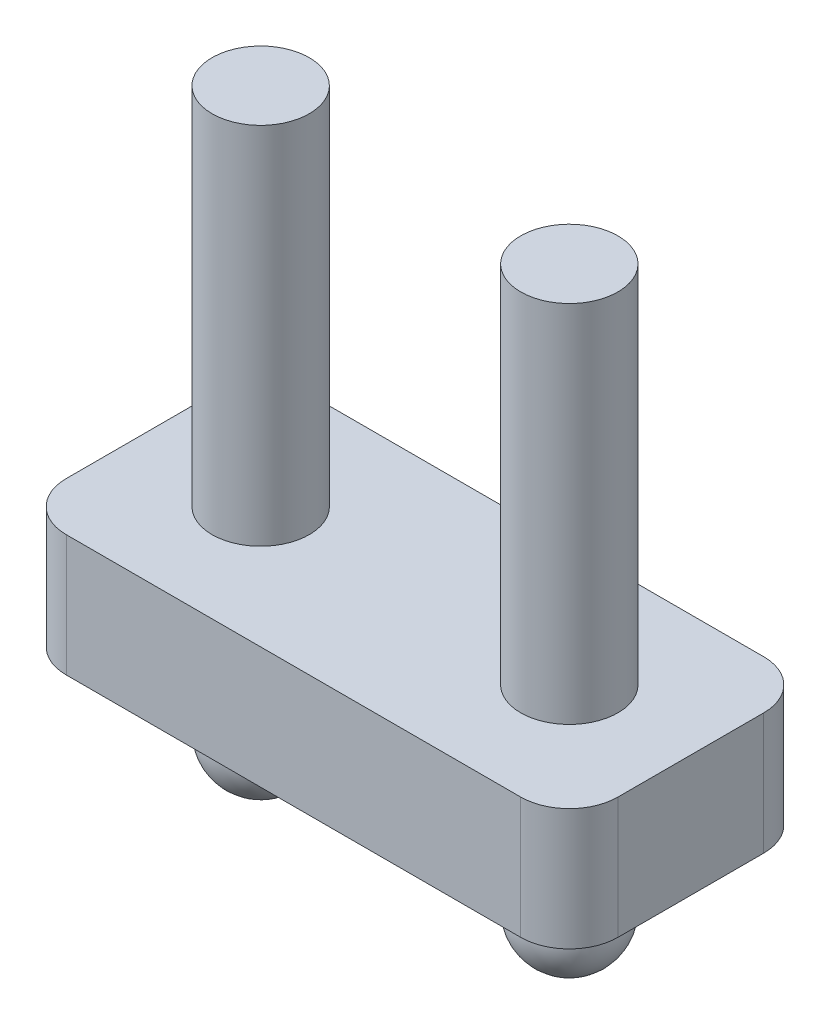
ISO-10303-21;
HEADER;
FILE_DESCRIPTION(('STEP AP214'),'2;1');
FILE_NAME('part.step','',(''),(''),'','','');
FILE_SCHEMA(('AUTOMOTIVE_DESIGN { 1 0 10303 214 1 1 1 1 }'));
ENDSEC;
DATA;
#1=APPLICATION_CONTEXT('core data for automotive mechanical design processes');
#2=APPLICATION_PROTOCOL_DEFINITION('international standard','automotive_design',2000,#1);
#3=PRODUCT_CONTEXT('',#1,'mechanical');
#4=PRODUCT('Part','Part','',(#3));
#5=PRODUCT_RELATED_PRODUCT_CATEGORY('part','',(#4));
#6=PRODUCT_DEFINITION_FORMATION('','',#4);
#7=PRODUCT_DEFINITION_CONTEXT('part definition',#1,'design');
#8=PRODUCT_DEFINITION('design','',#6,#7);
#9=PRODUCT_DEFINITION_SHAPE('','',#8);
#10=(LENGTH_UNIT() NAMED_UNIT(*) SI_UNIT(.MILLI.,.METRE.));
#11=(NAMED_UNIT(*) PLANE_ANGLE_UNIT() SI_UNIT($,.RADIAN.));
#12=(NAMED_UNIT(*) SI_UNIT($,.STERADIAN.) SOLID_ANGLE_UNIT());
#13=UNCERTAINTY_MEASURE_WITH_UNIT(LENGTH_MEASURE(1.E-05),#10,'distance_accuracy_value','');
#14=(GEOMETRIC_REPRESENTATION_CONTEXT(3) GLOBAL_UNCERTAINTY_ASSIGNED_CONTEXT((#13)) GLOBAL_UNIT_ASSIGNED_CONTEXT((#10,
#11,#12)) REPRESENTATION_CONTEXT('',''));
#15=CARTESIAN_POINT('',(0.,0.,0.));
#16=DIRECTION('',(0.,0.,1.));
#17=DIRECTION('',(1.,0.,0.));
#18=AXIS2_PLACEMENT_3D('',#15,#16,#17);
#19=CARTESIAN_POINT('',(0.,1.,0.));
#20=DIRECTION('',(0.,-1.,0.));
#21=DIRECTION('',(0.,0.,-1.));
#22=AXIS2_PLACEMENT_3D('',#19,#20,#21);
#23=PLANE('',#22);
#24=DIRECTION('',(-1.,0.,0.));
#25=VECTOR('',#24,1.);
#26=CARTESIAN_POINT('',(0.,1.,-2.));
#27=LINE('',#26,#25);
#28=CARTESIAN_POINT('',(4.14,1.,-2.));
#29=VERTEX_POINT('',#28);
#30=CARTESIAN_POINT('',(0.4,1.,-2.));
#31=VERTEX_POINT('',#30);
#32=EDGE_CURVE('E145',#29,#31,#27,.T.);
#33=ORIENTED_EDGE('',*,*,#32,.T.);
#34=CARTESIAN_POINT('',(0.4,1.,-1.6));
#35=DIRECTION('',(0.,-1.,0.));
#36=DIRECTION('',(0.,0.,-1.));
#37=AXIS2_PLACEMENT_3D('',#34,#35,#36);
#38=CIRCLE('',#37,0.4);
#39=CARTESIAN_POINT('',(0.,1.,-1.6));
#40=VERTEX_POINT('',#39);
#41=EDGE_CURVE('E164',#31,#40,#38,.F.);
#42=ORIENTED_EDGE('',*,*,#41,.T.);
#43=DIRECTION('',(0.,0.,1.));
#44=VECTOR('',#43,1.);
#45=CARTESIAN_POINT('',(0.,1.,0.));
#46=LINE('',#45,#44);
#47=CARTESIAN_POINT('',(0.,1.,-0.4));
#48=VERTEX_POINT('',#47);
#49=EDGE_CURVE('E128',#40,#48,#46,.T.);
#50=ORIENTED_EDGE('',*,*,#49,.T.);
#51=CARTESIAN_POINT('',(0.4,1.,-0.4));
#52=DIRECTION('',(0.,-1.,0.));
#53=DIRECTION('',(0.,0.,-1.));
#54=AXIS2_PLACEMENT_3D('',#51,#52,#53);
#55=CIRCLE('',#54,0.4);
#56=CARTESIAN_POINT('',(0.4,1.,0.));
#57=VERTEX_POINT('',#56);
#58=EDGE_CURVE('E159',#48,#57,#55,.F.);
#59=ORIENTED_EDGE('',*,*,#58,.T.);
#60=DIRECTION('',(1.,0.,0.));
#61=VECTOR('',#60,1.);
#62=CARTESIAN_POINT('',(0.,1.,0.));
#63=LINE('',#62,#61);
#64=CARTESIAN_POINT('',(4.14,1.,0.));
#65=VERTEX_POINT('',#64);
#66=EDGE_CURVE('E236',#57,#65,#63,.T.);
#67=ORIENTED_EDGE('',*,*,#66,.T.);
#68=CARTESIAN_POINT('',(4.14,1.,-0.4));
#69=DIRECTION('',(0.,-1.,0.));
#70=DIRECTION('',(0.,0.,-1.));
#71=AXIS2_PLACEMENT_3D('',#68,#69,#70);
#72=CIRCLE('',#71,0.4);
#73=CARTESIAN_POINT('',(4.54,1.,-0.4));
#74=VERTEX_POINT('',#73);
#75=EDGE_CURVE('E63',#65,#74,#72,.F.);
#76=ORIENTED_EDGE('',*,*,#75,.T.);
#77=DIRECTION('',(0.,0.,-1.));
#78=VECTOR('',#77,1.);
#79=CARTESIAN_POINT('',(4.54,1.,0.));
#80=LINE('',#79,#78);
#81=CARTESIAN_POINT('',(4.54,1.,-1.6));
#82=VERTEX_POINT('',#81);
#83=EDGE_CURVE('E238',#74,#82,#80,.T.);
#84=ORIENTED_EDGE('',*,*,#83,.T.);
#85=CARTESIAN_POINT('',(4.14,1.,-1.6));
#86=DIRECTION('',(0.,-1.,0.));
#87=DIRECTION('',(0.,0.,-1.));
#88=AXIS2_PLACEMENT_3D('',#85,#86,#87);
#89=CIRCLE('',#88,0.4);
#90=EDGE_CURVE('E162',#82,#29,#89,.F.);
#91=ORIENTED_EDGE('',*,*,#90,.T.);
#92=EDGE_LOOP('',(#33,#42,#50,#59,#67,#76,#84,#91));
#93=FACE_BOUND('',#92,.T.);
#94=CARTESIAN_POINT('',(1.,1.,-1.));
#95=DIRECTION('',(0.,1.,0.));
#96=DIRECTION('',(0.,0.,1.));
#97=AXIS2_PLACEMENT_3D('',#94,#95,#96);
#98=CIRCLE('',#97,0.4);
#99=CARTESIAN_POINT('',(1.,1.,-0.6));
#100=VERTEX_POINT('',#99);
#101=EDGE_CURVE('E136',#100,#100,#98,.T.);
#102=ORIENTED_EDGE('',*,*,#101,.F.);
#103=EDGE_LOOP('',(#102));
#104=FACE_BOUND('',#103,.T.);
#105=CARTESIAN_POINT('',(3.54,1.,-1.));
#106=DIRECTION('',(0.,1.,0.));
#107=DIRECTION('',(0.,0.,1.));
#108=AXIS2_PLACEMENT_3D('',#105,#106,#107);
#109=CIRCLE('',#108,0.400000000000002);
#110=CARTESIAN_POINT('',(3.54,1.,-0.599999999999998));
#111=VERTEX_POINT('',#110);
#112=EDGE_CURVE('E142',#111,#111,#109,.T.);
#113=ORIENTED_EDGE('',*,*,#112,.F.);
#114=EDGE_LOOP('',(#113));
#115=FACE_BOUND('',#114,.T.);
#116=ADVANCED_FACE('F41',(#93,#104,#115),#23,.F.);
#117=CARTESIAN_POINT('',(0.,0.,0.));
#118=DIRECTION('',(0.,-1.,0.));
#119=DIRECTION('',(0.,0.,-1.));
#120=AXIS2_PLACEMENT_3D('',#117,#118,#119);
#121=PLANE('',#120);
#122=CARTESIAN_POINT('',(1.,0.,-1.));
#123=DIRECTION('',(0.,-1.,0.));
#124=DIRECTION('',(0.,0.,-1.));
#125=AXIS2_PLACEMENT_3D('',#122,#123,#124);
#126=CIRCLE('',#125,0.4);
#127=CARTESIAN_POINT('',(1.,0.,-1.4));
#128=VERTEX_POINT('',#127);
#129=EDGE_CURVE('E244',#128,#128,#126,.T.);
#130=ORIENTED_EDGE('',*,*,#129,.F.);
#131=EDGE_LOOP('',(#130));
#132=FACE_BOUND('',#131,.T.);
#133=DIRECTION('',(0.,0.,1.));
#134=VECTOR('',#133,1.);
#135=CARTESIAN_POINT('',(0.,0.,0.));
#136=LINE('',#135,#134);
#137=CARTESIAN_POINT('',(0.,0.,-1.6));
#138=VERTEX_POINT('',#137);
#139=CARTESIAN_POINT('',(0.,0.,-0.4));
#140=VERTEX_POINT('',#139);
#141=EDGE_CURVE('E125',#138,#140,#136,.T.);
#142=ORIENTED_EDGE('',*,*,#141,.F.);
#143=CARTESIAN_POINT('',(0.4,0.,-1.6));
#144=DIRECTION('',(0.,-1.,0.));
#145=DIRECTION('',(0.,0.,-1.));
#146=AXIS2_PLACEMENT_3D('',#143,#144,#145);
#147=CIRCLE('',#146,0.4);
#148=CARTESIAN_POINT('',(0.4,0.,-2.));
#149=VERTEX_POINT('',#148);
#150=EDGE_CURVE('E108',#138,#149,#147,.T.);
#151=ORIENTED_EDGE('',*,*,#150,.T.);
#152=DIRECTION('',(-1.,0.,0.));
#153=VECTOR('',#152,1.);
#154=CARTESIAN_POINT('',(0.,0.,-2.));
#155=LINE('',#154,#153);
#156=CARTESIAN_POINT('',(4.14,0.,-2.));
#157=VERTEX_POINT('',#156);
#158=EDGE_CURVE('E149',#157,#149,#155,.T.);
#159=ORIENTED_EDGE('',*,*,#158,.F.);
#160=CARTESIAN_POINT('',(4.14,0.,-1.6));
#161=DIRECTION('',(0.,-1.,0.));
#162=DIRECTION('',(0.,0.,-1.));
#163=AXIS2_PLACEMENT_3D('',#160,#161,#162);
#164=CIRCLE('',#163,0.4);
#165=CARTESIAN_POINT('',(4.54,0.,-1.6));
#166=VERTEX_POINT('',#165);
#167=EDGE_CURVE('E119',#157,#166,#164,.T.);
#168=ORIENTED_EDGE('',*,*,#167,.T.);
#169=DIRECTION('',(0.,0.,-1.));
#170=VECTOR('',#169,1.);
#171=CARTESIAN_POINT('',(4.54,0.,0.));
#172=LINE('',#171,#170);
#173=CARTESIAN_POINT('',(4.54,0.,-0.4));
#174=VERTEX_POINT('',#173);
#175=EDGE_CURVE('E139',#174,#166,#172,.T.);
#176=ORIENTED_EDGE('',*,*,#175,.F.);
#177=CARTESIAN_POINT('',(4.14,0.,-0.4));
#178=DIRECTION('',(0.,-1.,0.));
#179=DIRECTION('',(0.,0.,-1.));
#180=AXIS2_PLACEMENT_3D('',#177,#178,#179);
#181=CIRCLE('',#180,0.4);
#182=CARTESIAN_POINT('',(4.14,0.,0.));
#183=VERTEX_POINT('',#182);
#184=EDGE_CURVE('E153',#174,#183,#181,.T.);
#185=ORIENTED_EDGE('',*,*,#184,.T.);
#186=DIRECTION('',(1.,0.,0.));
#187=VECTOR('',#186,1.);
#188=CARTESIAN_POINT('',(0.,0.,0.));
#189=LINE('',#188,#187);
#190=CARTESIAN_POINT('',(0.4,0.,0.));
#191=VERTEX_POINT('',#190);
#192=EDGE_CURVE('E135',#191,#183,#189,.T.);
#193=ORIENTED_EDGE('',*,*,#192,.F.);
#194=CARTESIAN_POINT('',(0.4,0.,-0.4));
#195=DIRECTION('',(0.,-1.,0.));
#196=DIRECTION('',(0.,0.,-1.));
#197=AXIS2_PLACEMENT_3D('',#194,#195,#196);
#198=CIRCLE('',#197,0.4);
#199=EDGE_CURVE('E129',#191,#140,#198,.T.);
#200=ORIENTED_EDGE('',*,*,#199,.T.);
#201=EDGE_LOOP('',(#142,#151,#159,#168,#176,#185,#193,#200));
#202=FACE_BOUND('',#201,.T.);
#203=CARTESIAN_POINT('',(3.54,0.,-1.));
#204=DIRECTION('',(0.,-1.,0.));
#205=DIRECTION('',(0.,0.,-1.));
#206=AXIS2_PLACEMENT_3D('',#203,#204,#205);
#207=CIRCLE('',#206,0.400000000000002);
#208=CARTESIAN_POINT('',(3.54,0.,-1.4));
#209=VERTEX_POINT('',#208);
#210=EDGE_CURVE('E250',#209,#209,#207,.T.);
#211=ORIENTED_EDGE('',*,*,#210,.F.);
#212=EDGE_LOOP('',(#211));
#213=FACE_BOUND('',#212,.T.);
#214=ADVANCED_FACE('F132',(#132,#202,#213),#121,.T.);
#215=CARTESIAN_POINT('',(0.,1.,0.));
#216=DIRECTION('',(1.,0.,0.));
#217=DIRECTION('',(0.,0.,-1.));
#218=AXIS2_PLACEMENT_3D('',#215,#216,#217);
#219=PLANE('',#218);
#220=ORIENTED_EDGE('',*,*,#49,.F.);
#221=DIRECTION('',(0.,-1.,0.));
#222=VECTOR('',#221,1.);
#223=CARTESIAN_POINT('',(0.,1.,-1.6));
#224=LINE('',#223,#222);
#225=EDGE_CURVE('E112',#40,#138,#224,.T.);
#226=ORIENTED_EDGE('',*,*,#225,.T.);
#227=ORIENTED_EDGE('',*,*,#141,.T.);
#228=DIRECTION('',(0.,-1.,0.));
#229=VECTOR('',#228,1.);
#230=CARTESIAN_POINT('',(0.,1.,-0.4));
#231=LINE('',#230,#229);
#232=EDGE_CURVE('E130',#140,#48,#231,.F.);
#233=ORIENTED_EDGE('',*,*,#232,.T.);
#234=EDGE_LOOP('',(#220,#226,#227,#233));
#235=FACE_BOUND('',#234,.T.);
#236=ADVANCED_FACE('F124',(#235),#219,.F.);
#237=CARTESIAN_POINT('',(0.,1.,0.));
#238=DIRECTION('',(0.,0.,-1.));
#239=DIRECTION('',(-1.,0.,0.));
#240=AXIS2_PLACEMENT_3D('',#237,#238,#239);
#241=PLANE('',#240);
#242=ORIENTED_EDGE('',*,*,#192,.T.);
#243=DIRECTION('',(0.,-1.,0.));
#244=VECTOR('',#243,1.);
#245=CARTESIAN_POINT('',(4.14,1.,0.));
#246=LINE('',#245,#244);
#247=EDGE_CURVE('E173',#183,#65,#246,.F.);
#248=ORIENTED_EDGE('',*,*,#247,.T.);
#249=ORIENTED_EDGE('',*,*,#66,.F.);
#250=DIRECTION('',(0.,-1.,0.));
#251=VECTOR('',#250,1.);
#252=CARTESIAN_POINT('',(0.4,1.,0.));
#253=LINE('',#252,#251);
#254=EDGE_CURVE('E170',#57,#191,#253,.T.);
#255=ORIENTED_EDGE('',*,*,#254,.T.);
#256=EDGE_LOOP('',(#242,#248,#249,#255));
#257=FACE_BOUND('',#256,.T.);
#258=ADVANCED_FACE('F211',(#257),#241,.F.);
#259=CARTESIAN_POINT('',(4.54,1.,0.));
#260=DIRECTION('',(-1.,0.,0.));
#261=DIRECTION('',(0.,0.,1.));
#262=AXIS2_PLACEMENT_3D('',#259,#260,#261);
#263=PLANE('',#262);
#264=ORIENTED_EDGE('',*,*,#175,.T.);
#265=DIRECTION('',(0.,-1.,0.));
#266=VECTOR('',#265,1.);
#267=CARTESIAN_POINT('',(4.54,1.,-1.6));
#268=LINE('',#267,#266);
#269=EDGE_CURVE('E56',#166,#82,#268,.F.);
#270=ORIENTED_EDGE('',*,*,#269,.T.);
#271=ORIENTED_EDGE('',*,*,#83,.F.);
#272=DIRECTION('',(0.,-1.,0.));
#273=VECTOR('',#272,1.);
#274=CARTESIAN_POINT('',(4.54,1.,-0.4));
#275=LINE('',#274,#273);
#276=EDGE_CURVE('E166',#74,#174,#275,.T.);
#277=ORIENTED_EDGE('',*,*,#276,.T.);
#278=EDGE_LOOP('',(#264,#270,#271,#277));
#279=FACE_BOUND('',#278,.T.);
#280=ADVANCED_FACE('F207',(#279),#263,.F.);
#281=CARTESIAN_POINT('',(0.,1.,-2.));
#282=DIRECTION('',(0.,0.,1.));
#283=DIRECTION('',(1.,0.,0.));
#284=AXIS2_PLACEMENT_3D('',#281,#282,#283);
#285=PLANE('',#284);
#286=ORIENTED_EDGE('',*,*,#158,.T.);
#287=DIRECTION('',(0.,-1.,0.));
#288=VECTOR('',#287,1.);
#289=CARTESIAN_POINT('',(0.4,1.,-2.));
#290=LINE('',#289,#288);
#291=EDGE_CURVE('E113',#149,#31,#290,.F.);
#292=ORIENTED_EDGE('',*,*,#291,.T.);
#293=ORIENTED_EDGE('',*,*,#32,.F.);
#294=DIRECTION('',(0.,-1.,0.));
#295=VECTOR('',#294,1.);
#296=CARTESIAN_POINT('',(4.14,1.,-2.));
#297=LINE('',#296,#295);
#298=EDGE_CURVE('E118',#29,#157,#297,.T.);
#299=ORIENTED_EDGE('',*,*,#298,.T.);
#300=EDGE_LOOP('',(#286,#292,#293,#299));
#301=FACE_BOUND('',#300,.T.);
#302=ADVANCED_FACE('F204',(#301),#285,.F.);
#303=CARTESIAN_POINT('',(0.4,1.,-1.6));
#304=DIRECTION('',(0.,-1.,0.));
#305=DIRECTION('',(0.,0.,-1.));
#306=AXIS2_PLACEMENT_3D('',#303,#304,#305);
#307=CYLINDRICAL_SURFACE('',#306,0.4);
#308=ORIENTED_EDGE('',*,*,#41,.F.);
#309=ORIENTED_EDGE('',*,*,#291,.F.);
#310=ORIENTED_EDGE('',*,*,#150,.F.);
#311=ORIENTED_EDGE('',*,*,#225,.F.);
#312=EDGE_LOOP('',(#308,#309,#310,#311));
#313=FACE_BOUND('',#312,.T.);
#314=ADVANCED_FACE('F111',(#313),#307,.T.);
#315=CARTESIAN_POINT('',(4.14,1.,-1.6));
#316=DIRECTION('',(0.,-1.,0.));
#317=DIRECTION('',(0.,0.,-1.));
#318=AXIS2_PLACEMENT_3D('',#315,#316,#317);
#319=CYLINDRICAL_SURFACE('',#318,0.4);
#320=ORIENTED_EDGE('',*,*,#90,.F.);
#321=ORIENTED_EDGE('',*,*,#269,.F.);
#322=ORIENTED_EDGE('',*,*,#167,.F.);
#323=ORIENTED_EDGE('',*,*,#298,.F.);
#324=EDGE_LOOP('',(#320,#321,#322,#323));
#325=FACE_BOUND('',#324,.T.);
#326=ADVANCED_FACE('F219',(#325),#319,.T.);
#327=CARTESIAN_POINT('',(4.14,1.,-0.4));
#328=DIRECTION('',(0.,-1.,0.));
#329=DIRECTION('',(0.,0.,-1.));
#330=AXIS2_PLACEMENT_3D('',#327,#328,#329);
#331=CYLINDRICAL_SURFACE('',#330,0.4);
#332=ORIENTED_EDGE('',*,*,#75,.F.);
#333=ORIENTED_EDGE('',*,*,#247,.F.);
#334=ORIENTED_EDGE('',*,*,#184,.F.);
#335=ORIENTED_EDGE('',*,*,#276,.F.);
#336=EDGE_LOOP('',(#332,#333,#334,#335));
#337=FACE_BOUND('',#336,.T.);
#338=ADVANCED_FACE('F222',(#337),#331,.T.);
#339=CARTESIAN_POINT('',(0.4,1.,-0.4));
#340=DIRECTION('',(0.,-1.,0.));
#341=DIRECTION('',(0.,0.,-1.));
#342=AXIS2_PLACEMENT_3D('',#339,#340,#341);
#343=CYLINDRICAL_SURFACE('',#342,0.4);
#344=ORIENTED_EDGE('',*,*,#58,.F.);
#345=ORIENTED_EDGE('',*,*,#232,.F.);
#346=ORIENTED_EDGE('',*,*,#199,.F.);
#347=ORIENTED_EDGE('',*,*,#254,.F.);
#348=EDGE_LOOP('',(#344,#345,#346,#347));
#349=FACE_BOUND('',#348,.T.);
#350=ADVANCED_FACE('F225',(#349),#343,.T.);
#351=CARTESIAN_POINT('',(1.,-1.,-1.));
#352=DIRECTION('',(0.,1.,0.));
#353=DIRECTION('',(0.,0.,1.));
#354=AXIS2_PLACEMENT_3D('',#351,#352,#353);
#355=CYLINDRICAL_SURFACE('',#354,0.4);
#356=CARTESIAN_POINT('',(1.,-0.6,-1.));
#357=DIRECTION('',(0.,1.,0.));
#358=DIRECTION('',(0.,0.,1.));
#359=AXIS2_PLACEMENT_3D('',#356,#357,#358);
#360=CIRCLE('',#359,0.4);
#361=CARTESIAN_POINT('',(1.,-0.6,-0.6));
#362=VERTEX_POINT('',#361);
#363=EDGE_CURVE('E49',#362,#362,#360,.T.);
#364=ORIENTED_EDGE('',*,*,#363,.T.);
#365=EDGE_LOOP('',(#364));
#366=FACE_BOUND('',#365,.T.);
#367=ORIENTED_EDGE('',*,*,#129,.T.);
#368=EDGE_LOOP('',(#367));
#369=FACE_BOUND('',#368,.T.);
#370=ADVANCED_FACE('F177',(#366,#369),#355,.T.);
#371=CARTESIAN_POINT('',(1.,4.,-1.));
#372=DIRECTION('',(0.,1.,0.));
#373=DIRECTION('',(0.,0.,1.));
#374=AXIS2_PLACEMENT_3D('',#371,#372,#373);
#375=CIRCLE('',#374,0.4);
#376=CARTESIAN_POINT('',(1.,4.,-0.6));
#377=VERTEX_POINT('',#376);
#378=EDGE_CURVE('E247',#377,#377,#375,.T.);
#379=ORIENTED_EDGE('',*,*,#378,.F.);
#380=EDGE_LOOP('',(#379));
#381=FACE_BOUND('',#380,.T.);
#382=ORIENTED_EDGE('',*,*,#101,.T.);
#383=EDGE_LOOP('',(#382));
#384=FACE_BOUND('',#383,.T.);
#385=ADVANCED_FACE('F232',(#381,#384),#355,.T.);
#386=CARTESIAN_POINT('',(1.,4.,-1.));
#387=DIRECTION('',(0.,1.,0.));
#388=DIRECTION('',(0.,0.,1.));
#389=AXIS2_PLACEMENT_3D('',#386,#387,#388);
#390=PLANE('',#389);
#391=ORIENTED_EDGE('',*,*,#378,.T.);
#392=EDGE_LOOP('',(#391));
#393=FACE_BOUND('',#392,.T.);
#394=ADVANCED_FACE('F266',(#393),#390,.T.);
#395=CARTESIAN_POINT('',(3.54,-1.,-1.));
#396=DIRECTION('',(0.,1.,0.));
#397=DIRECTION('',(0.,0.,1.));
#398=AXIS2_PLACEMENT_3D('',#395,#396,#397);
#399=CYLINDRICAL_SURFACE('',#398,0.400000000000002);
#400=CARTESIAN_POINT('',(3.54,-0.6,-1.));
#401=DIRECTION('',(0.,1.,0.));
#402=DIRECTION('',(0.,0.,1.));
#403=AXIS2_PLACEMENT_3D('',#400,#401,#402);
#404=CIRCLE('',#403,0.400000000000002);
#405=CARTESIAN_POINT('',(3.54,-0.6,-0.599999999999998));
#406=VERTEX_POINT('',#405);
#407=EDGE_CURVE('E11',#406,#406,#404,.T.);
#408=ORIENTED_EDGE('',*,*,#407,.T.);
#409=EDGE_LOOP('',(#408));
#410=FACE_BOUND('',#409,.T.);
#411=ORIENTED_EDGE('',*,*,#210,.T.);
#412=EDGE_LOOP('',(#411));
#413=FACE_BOUND('',#412,.T.);
#414=ADVANCED_FACE('F259',(#410,#413),#399,.T.);
#415=CARTESIAN_POINT('',(3.54,4.,-1.));
#416=DIRECTION('',(0.,1.,0.));
#417=DIRECTION('',(0.,0.,1.));
#418=AXIS2_PLACEMENT_3D('',#415,#416,#417);
#419=CIRCLE('',#418,0.400000000000002);
#420=CARTESIAN_POINT('',(3.54,4.,-0.599999999999998));
#421=VERTEX_POINT('',#420);
#422=EDGE_CURVE('E253',#421,#421,#419,.T.);
#423=ORIENTED_EDGE('',*,*,#422,.F.);
#424=EDGE_LOOP('',(#423));
#425=FACE_BOUND('',#424,.T.);
#426=ORIENTED_EDGE('',*,*,#112,.T.);
#427=EDGE_LOOP('',(#426));
#428=FACE_BOUND('',#427,.T.);
#429=ADVANCED_FACE('F188',(#425,#428),#399,.T.);
#430=CARTESIAN_POINT('',(3.54,4.,-1.));
#431=DIRECTION('',(0.,1.,0.));
#432=DIRECTION('',(0.,0.,1.));
#433=AXIS2_PLACEMENT_3D('',#430,#431,#432);
#434=PLANE('',#433);
#435=ORIENTED_EDGE('',*,*,#422,.T.);
#436=EDGE_LOOP('',(#435));
#437=FACE_BOUND('',#436,.T.);
#438=ADVANCED_FACE('F182',(#437),#434,.T.);
#439=CARTESIAN_POINT('',(1.,-0.6,-1.));
#440=DIRECTION('',(0.,1.,0.));
#441=DIRECTION('',(0.,0.,1.));
#442=AXIS2_PLACEMENT_3D('',#439,#440,#441);
#443=SPHERICAL_SURFACE('',#442,0.4);
#444=ORIENTED_EDGE('',*,*,#363,.F.);
#445=EDGE_LOOP('',(#444));
#446=FACE_BOUND('',#445,.T.);
#447=ADVANCED_FACE('F180',(#446),#443,.T.);
#448=CARTESIAN_POINT('',(3.54,-0.6,-1.));
#449=DIRECTION('',(0.,1.,0.));
#450=DIRECTION('',(0.,0.,1.));
#451=AXIS2_PLACEMENT_3D('',#448,#449,#450);
#452=SPHERICAL_SURFACE('',#451,0.4);
#453=ORIENTED_EDGE('',*,*,#407,.F.);
#454=EDGE_LOOP('',(#453));
#455=FACE_BOUND('',#454,.T.);
#456=ADVANCED_FACE('F43',(#455),#452,.T.);
#457=CLOSED_SHELL('',(#116,#214,#236,#258,#280,#302,#314,#326,#338,#350,#370,#385,#394,#414,
#429,#438,#447,#456));
#458=MANIFOLD_SOLID_BREP('B2',#457);
#459=ADVANCED_BREP_SHAPE_REPRESENTATION('',(#18,#458),#14);
#460=SHAPE_DEFINITION_REPRESENTATION(#9,#459);
ENDSEC;
END-ISO-10303-21;
